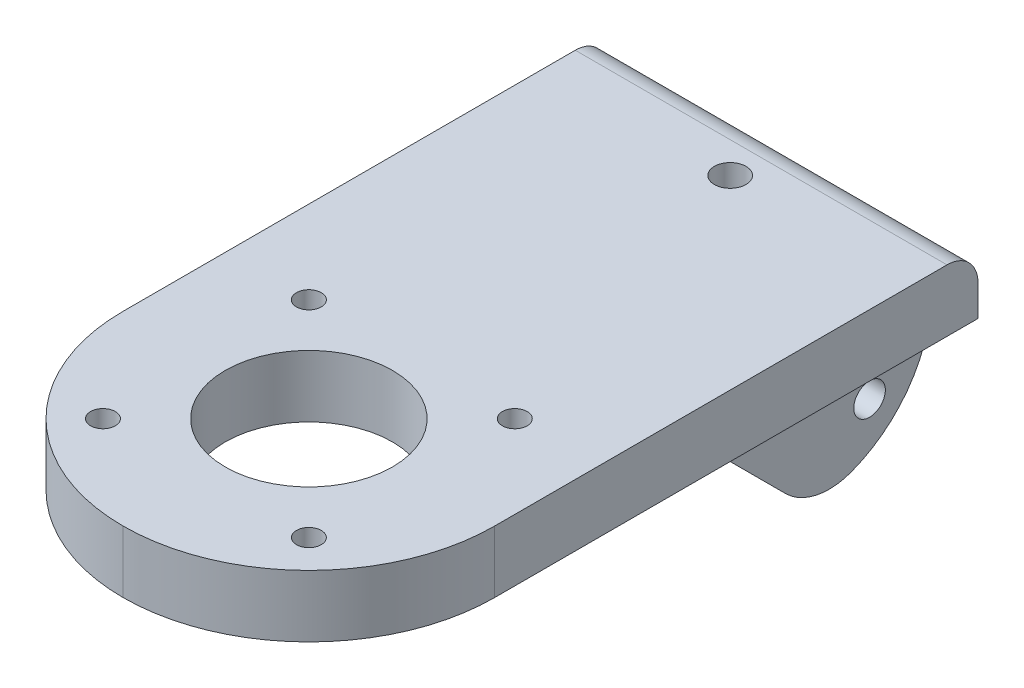
ISO-10303-21;
HEADER;
FILE_DESCRIPTION(('STEP AP214'),'2;1');
FILE_NAME('part.step','',(''),(''),'','','');
FILE_SCHEMA(('AUTOMOTIVE_DESIGN { 1 0 10303 214 1 1 1 1 }'));
ENDSEC;
DATA;
#1=APPLICATION_CONTEXT('core data for automotive mechanical design processes');
#2=APPLICATION_PROTOCOL_DEFINITION('international standard','automotive_design',2000,#1);
#3=PRODUCT_CONTEXT('',#1,'mechanical');
#4=PRODUCT('Part','Part','',(#3));
#5=PRODUCT_RELATED_PRODUCT_CATEGORY('part','',(#4));
#6=PRODUCT_DEFINITION_FORMATION('','',#4);
#7=PRODUCT_DEFINITION_CONTEXT('part definition',#1,'design');
#8=PRODUCT_DEFINITION('design','',#6,#7);
#9=PRODUCT_DEFINITION_SHAPE('','',#8);
#10=(LENGTH_UNIT() NAMED_UNIT(*) SI_UNIT(.MILLI.,.METRE.));
#11=(NAMED_UNIT(*) PLANE_ANGLE_UNIT() SI_UNIT($,.RADIAN.));
#12=(NAMED_UNIT(*) SI_UNIT($,.STERADIAN.) SOLID_ANGLE_UNIT());
#13=UNCERTAINTY_MEASURE_WITH_UNIT(LENGTH_MEASURE(1.E-05),#10,'distance_accuracy_value','');
#14=(GEOMETRIC_REPRESENTATION_CONTEXT(3) GLOBAL_UNCERTAINTY_ASSIGNED_CONTEXT((#13)) GLOBAL_UNIT_ASSIGNED_CONTEXT((#10,
#11,#12)) REPRESENTATION_CONTEXT('',''));
#15=CARTESIAN_POINT('',(0.,0.,0.));
#16=DIRECTION('',(0.,0.,1.));
#17=DIRECTION('',(1.,0.,0.));
#18=AXIS2_PLACEMENT_3D('',#15,#16,#17);
#19=CARTESIAN_POINT('',(-30.,10.,0.));
#20=DIRECTION('',(-1.,0.,0.));
#21=DIRECTION('',(0.,0.,1.));
#22=AXIS2_PLACEMENT_3D('',#19,#20,#21);
#23=PLANE('',#22);
#24=DIRECTION('',(0.,0.,-1.));
#25=VECTOR('',#24,1.);
#26=CARTESIAN_POINT('',(-30.,10.,0.));
#27=LINE('',#26,#25);
#28=CARTESIAN_POINT('',(-30.,10.,0.));
#29=VERTEX_POINT('',#28);
#30=CARTESIAN_POINT('',(-30.,10.,-73.));
#31=VERTEX_POINT('',#30);
#32=EDGE_CURVE('E395',#29,#31,#27,.T.);
#33=ORIENTED_EDGE('',*,*,#32,.T.);
#34=CARTESIAN_POINT('',(-30.,5.,-73.));
#35=DIRECTION('',(-1.,0.,0.));
#36=DIRECTION('',(0.,0.,1.));
#37=AXIS2_PLACEMENT_3D('',#34,#35,#36);
#38=CIRCLE('',#37,5.);
#39=CARTESIAN_POINT('',(-30.,5.,-78.));
#40=VERTEX_POINT('',#39);
#41=EDGE_CURVE('E262',#31,#40,#38,.T.);
#42=ORIENTED_EDGE('',*,*,#41,.T.);
#43=DIRECTION('',(0.,-1.,0.));
#44=VECTOR('',#43,1.);
#45=CARTESIAN_POINT('',(-30.,10.,-78.));
#46=LINE('',#45,#44);
#47=CARTESIAN_POINT('',(-30.,0.,-78.));
#48=VERTEX_POINT('',#47);
#49=EDGE_CURVE('E176',#40,#48,#46,.T.);
#50=ORIENTED_EDGE('',*,*,#49,.T.);
#51=DIRECTION('',(0.,0.,-1.));
#52=VECTOR('',#51,1.);
#53=CARTESIAN_POINT('',(-30.,0.,0.));
#54=LINE('',#53,#52);
#55=CARTESIAN_POINT('',(-30.,0.,0.));
#56=VERTEX_POINT('',#55);
#57=EDGE_CURVE('E182',#56,#48,#54,.T.);
#58=ORIENTED_EDGE('',*,*,#57,.F.);
#59=DIRECTION('',(0.,-1.,0.));
#60=VECTOR('',#59,1.);
#61=CARTESIAN_POINT('',(-30.,10.,0.));
#62=LINE('',#61,#60);
#63=EDGE_CURVE('E198',#56,#29,#62,.F.);
#64=ORIENTED_EDGE('',*,*,#63,.T.);
#65=EDGE_LOOP('',(#33,#42,#50,#58,#64));
#66=FACE_BOUND('',#65,.T.);
#67=ADVANCED_FACE('F38',(#66),#23,.T.);
#68=CARTESIAN_POINT('',(30.,10.,0.));
#69=DIRECTION('',(-1.,0.,0.));
#70=DIRECTION('',(0.,0.,1.));
#71=AXIS2_PLACEMENT_3D('',#68,#69,#70);
#72=PLANE('',#71);
#73=DIRECTION('',(0.,-1.,0.));
#74=VECTOR('',#73,1.);
#75=CARTESIAN_POINT('',(30.,10.,-78.));
#76=LINE('',#75,#74);
#77=CARTESIAN_POINT('',(30.,5.,-78.));
#78=VERTEX_POINT('',#77);
#79=CARTESIAN_POINT('',(30.,0.,-78.));
#80=VERTEX_POINT('',#79);
#81=EDGE_CURVE('E169',#78,#80,#76,.T.);
#82=ORIENTED_EDGE('',*,*,#81,.F.);
#83=CARTESIAN_POINT('',(30.,5.,-73.));
#84=DIRECTION('',(-1.,0.,0.));
#85=DIRECTION('',(0.,0.,1.));
#86=AXIS2_PLACEMENT_3D('',#83,#84,#85);
#87=CIRCLE('',#86,5.);
#88=CARTESIAN_POINT('',(30.,10.,-73.));
#89=VERTEX_POINT('',#88);
#90=EDGE_CURVE('E258',#78,#89,#87,.F.);
#91=ORIENTED_EDGE('',*,*,#90,.T.);
#92=DIRECTION('',(0.,0.,-1.));
#93=VECTOR('',#92,1.);
#94=CARTESIAN_POINT('',(30.,10.,0.));
#95=LINE('',#94,#93);
#96=CARTESIAN_POINT('',(30.,10.,0.));
#97=VERTEX_POINT('',#96);
#98=EDGE_CURVE('E389',#97,#89,#95,.T.);
#99=ORIENTED_EDGE('',*,*,#98,.F.);
#100=DIRECTION('',(0.,-1.,0.));
#101=VECTOR('',#100,1.);
#102=CARTESIAN_POINT('',(30.,0.,0.));
#103=LINE('',#102,#101);
#104=CARTESIAN_POINT('',(30.,0.,0.));
#105=VERTEX_POINT('',#104);
#106=EDGE_CURVE('E181',#97,#105,#103,.T.);
#107=ORIENTED_EDGE('',*,*,#106,.T.);
#108=DIRECTION('',(0.,0.,-1.));
#109=VECTOR('',#108,1.);
#110=CARTESIAN_POINT('',(30.,0.,0.));
#111=LINE('',#110,#109);
#112=EDGE_CURVE('E159',#105,#80,#111,.T.);
#113=ORIENTED_EDGE('',*,*,#112,.T.);
#114=EDGE_LOOP('',(#82,#91,#99,#107,#113));
#115=FACE_BOUND('',#114,.T.);
#116=ADVANCED_FACE('F178',(#115),#72,.F.);
#117=CARTESIAN_POINT('',(0.,10.,-78.));
#118=DIRECTION('',(0.,0.,-1.));
#119=DIRECTION('',(-1.,0.,0.));
#120=AXIS2_PLACEMENT_3D('',#117,#118,#119);
#121=PLANE('',#120);
#122=ORIENTED_EDGE('',*,*,#49,.F.);
#123=DIRECTION('',(1.,0.,0.));
#124=VECTOR('',#123,1.);
#125=CARTESIAN_POINT('',(0.,5.,-78.));
#126=LINE('',#125,#124);
#127=EDGE_CURVE('E173',#40,#78,#126,.T.);
#128=ORIENTED_EDGE('',*,*,#127,.T.);
#129=ORIENTED_EDGE('',*,*,#81,.T.);
#130=DIRECTION('',(1.,0.,0.));
#131=VECTOR('',#130,1.);
#132=CARTESIAN_POINT('',(0.,0.,-78.));
#133=LINE('',#132,#131);
#134=CARTESIAN_POINT('',(27.5,0.,-78.));
#135=VERTEX_POINT('',#134);
#136=EDGE_CURVE('E154',#135,#80,#133,.T.);
#137=ORIENTED_EDGE('',*,*,#136,.F.);
#138=DIRECTION('',(1.,0.,0.));
#139=VECTOR('',#138,1.);
#140=CARTESIAN_POINT('',(0.,0.,-78.));
#141=LINE('',#140,#139);
#142=CARTESIAN_POINT('',(10.5,0.,-78.));
#143=VERTEX_POINT('',#142);
#144=EDGE_CURVE('E227',#135,#143,#141,.F.);
#145=ORIENTED_EDGE('',*,*,#144,.T.);
#146=CARTESIAN_POINT('',(-10.5,0.,-78.));
#147=VERTEX_POINT('',#146);
#148=EDGE_CURVE('E164',#147,#143,#133,.T.);
#149=ORIENTED_EDGE('',*,*,#148,.F.);
#150=DIRECTION('',(1.,0.,0.));
#151=VECTOR('',#150,1.);
#152=CARTESIAN_POINT('',(0.,0.,-78.));
#153=LINE('',#152,#151);
#154=CARTESIAN_POINT('',(-27.5,0.,-78.));
#155=VERTEX_POINT('',#154);
#156=EDGE_CURVE('E60',#147,#155,#153,.F.);
#157=ORIENTED_EDGE('',*,*,#156,.T.);
#158=EDGE_CURVE('E166',#48,#155,#133,.T.);
#159=ORIENTED_EDGE('',*,*,#158,.F.);
#160=EDGE_LOOP('',(#122,#128,#129,#137,#145,#149,#157,#159));
#161=FACE_BOUND('',#160,.T.);
#162=ADVANCED_FACE('F171',(#161),#121,.T.);
#163=CARTESIAN_POINT('',(0.,10.,0.));
#164=DIRECTION('',(0.,-1.,0.));
#165=DIRECTION('',(0.,0.,-1.));
#166=AXIS2_PLACEMENT_3D('',#163,#164,#165);
#167=CYLINDRICAL_SURFACE('',#166,13.5);
#168=CARTESIAN_POINT('',(0.,10.,0.));
#169=DIRECTION('',(0.,1.,0.));
#170=DIRECTION('',(0.,0.,1.));
#171=AXIS2_PLACEMENT_3D('',#168,#169,#170);
#172=CIRCLE('',#171,13.5);
#173=CARTESIAN_POINT('',(0.,10.,13.5));
#174=VERTEX_POINT('',#173);
#175=EDGE_CURVE('E399',#174,#174,#172,.T.);
#176=ORIENTED_EDGE('',*,*,#175,.T.);
#177=EDGE_LOOP('',(#176));
#178=FACE_BOUND('',#177,.T.);
#179=CARTESIAN_POINT('',(0.,0.,0.));
#180=DIRECTION('',(0.,1.,0.));
#181=DIRECTION('',(0.,0.,1.));
#182=AXIS2_PLACEMENT_3D('',#179,#180,#181);
#183=CIRCLE('',#182,13.5);
#184=CARTESIAN_POINT('',(0.,0.,13.5));
#185=VERTEX_POINT('',#184);
#186=EDGE_CURVE('E185',#185,#185,#183,.T.);
#187=ORIENTED_EDGE('',*,*,#186,.F.);
#188=EDGE_LOOP('',(#187));
#189=FACE_BOUND('',#188,.T.);
#190=ADVANCED_FACE('F324',(#178,#189),#167,.F.);
#191=CARTESIAN_POINT('',(16.6170093578841,10.,-16.6170093578845));
#192=DIRECTION('',(0.,-1.,0.));
#193=DIRECTION('',(0.,0.,-1.));
#194=AXIS2_PLACEMENT_3D('',#191,#192,#193);
#195=CYLINDRICAL_SURFACE('',#194,2.00000000000051);
#196=CARTESIAN_POINT('',(16.6170093578841,10.,-16.6170093578845));
#197=DIRECTION('',(0.,1.,0.));
#198=DIRECTION('',(0.,0.,1.));
#199=AXIS2_PLACEMENT_3D('',#196,#197,#198);
#200=CIRCLE('',#199,2.00000000000051);
#201=CARTESIAN_POINT('',(16.6170093578841,10.,-14.617009357884));
#202=VERTEX_POINT('',#201);
#203=EDGE_CURVE('E598',#202,#202,#200,.T.);
#204=ORIENTED_EDGE('',*,*,#203,.T.);
#205=EDGE_LOOP('',(#204));
#206=FACE_BOUND('',#205,.T.);
#207=CARTESIAN_POINT('',(16.6170093578841,0.,-16.6170093578845));
#208=DIRECTION('',(0.,1.,0.));
#209=DIRECTION('',(0.,0.,1.));
#210=AXIS2_PLACEMENT_3D('',#207,#208,#209);
#211=CIRCLE('',#210,2.00000000000051);
#212=CARTESIAN_POINT('',(16.6170093578841,0.,-14.617009357884));
#213=VERTEX_POINT('',#212);
#214=EDGE_CURVE('E411',#213,#213,#211,.T.);
#215=ORIENTED_EDGE('',*,*,#214,.F.);
#216=EDGE_LOOP('',(#215));
#217=FACE_BOUND('',#216,.T.);
#218=ADVANCED_FACE('F327',(#206,#217),#195,.F.);
#219=CARTESIAN_POINT('',(16.6170093578861,10.,16.6170093578829));
#220=DIRECTION('',(0.,-1.,0.));
#221=DIRECTION('',(0.,0.,-1.));
#222=AXIS2_PLACEMENT_3D('',#219,#220,#221);
#223=CYLINDRICAL_SURFACE('',#222,2.00000000000225);
#224=CARTESIAN_POINT('',(16.6170093578861,10.,16.6170093578829));
#225=DIRECTION('',(0.,1.,0.));
#226=DIRECTION('',(0.,0.,1.));
#227=AXIS2_PLACEMENT_3D('',#224,#225,#226);
#228=CIRCLE('',#227,2.00000000000225);
#229=CARTESIAN_POINT('',(16.6170093578861,10.,18.6170093578852));
#230=VERTEX_POINT('',#229);
#231=EDGE_CURVE('E595',#230,#230,#228,.T.);
#232=ORIENTED_EDGE('',*,*,#231,.T.);
#233=EDGE_LOOP('',(#232));
#234=FACE_BOUND('',#233,.T.);
#235=CARTESIAN_POINT('',(16.6170093578861,0.,16.6170093578829));
#236=DIRECTION('',(0.,1.,0.));
#237=DIRECTION('',(0.,0.,1.));
#238=AXIS2_PLACEMENT_3D('',#235,#236,#237);
#239=CIRCLE('',#238,2.00000000000225);
#240=CARTESIAN_POINT('',(16.6170093578861,0.,18.6170093578852));
#241=VERTEX_POINT('',#240);
#242=EDGE_CURVE('E408',#241,#241,#239,.T.);
#243=ORIENTED_EDGE('',*,*,#242,.F.);
#244=EDGE_LOOP('',(#243));
#245=FACE_BOUND('',#244,.T.);
#246=ADVANCED_FACE('F331',(#234,#245),#223,.F.);
#247=CARTESIAN_POINT('',(-16.6170093578816,10.,16.6170093578848));
#248=DIRECTION('',(0.,-1.,0.));
#249=DIRECTION('',(0.,0.,-1.));
#250=AXIS2_PLACEMENT_3D('',#247,#248,#249);
#251=CYLINDRICAL_SURFACE('',#250,2.00000000000264);
#252=CARTESIAN_POINT('',(-16.6170093578816,10.,16.6170093578848));
#253=DIRECTION('',(0.,1.,0.));
#254=DIRECTION('',(0.,0.,1.));
#255=AXIS2_PLACEMENT_3D('',#252,#253,#254);
#256=CIRCLE('',#255,2.00000000000264);
#257=CARTESIAN_POINT('',(-16.6170093578816,10.,18.6170093578875));
#258=VERTEX_POINT('',#257);
#259=EDGE_CURVE('E592',#258,#258,#256,.T.);
#260=ORIENTED_EDGE('',*,*,#259,.T.);
#261=EDGE_LOOP('',(#260));
#262=FACE_BOUND('',#261,.T.);
#263=CARTESIAN_POINT('',(-16.6170093578816,0.,16.6170093578848));
#264=DIRECTION('',(0.,1.,0.));
#265=DIRECTION('',(0.,0.,1.));
#266=AXIS2_PLACEMENT_3D('',#263,#264,#265);
#267=CIRCLE('',#266,2.00000000000264);
#268=CARTESIAN_POINT('',(-16.6170093578816,0.,18.6170093578875));
#269=VERTEX_POINT('',#268);
#270=EDGE_CURVE('E405',#269,#269,#267,.T.);
#271=ORIENTED_EDGE('',*,*,#270,.F.);
#272=EDGE_LOOP('',(#271));
#273=FACE_BOUND('',#272,.T.);
#274=ADVANCED_FACE('F335',(#262,#273),#251,.F.);
#275=CARTESIAN_POINT('',(-16.6170093578835,10.,-16.6170093578829));
#276=DIRECTION('',(0.,-1.,0.));
#277=DIRECTION('',(0.,0.,-1.));
#278=AXIS2_PLACEMENT_3D('',#275,#276,#277);
#279=CYLINDRICAL_SURFACE('',#278,2.00000000000093);
#280=CARTESIAN_POINT('',(-16.6170093578835,10.,-16.6170093578829));
#281=DIRECTION('',(0.,1.,0.));
#282=DIRECTION('',(0.,0.,1.));
#283=AXIS2_PLACEMENT_3D('',#280,#281,#282);
#284=CIRCLE('',#283,2.00000000000093);
#285=CARTESIAN_POINT('',(-16.6170093578835,10.,-14.617009357882));
#286=VERTEX_POINT('',#285);
#287=EDGE_CURVE('E192',#286,#286,#284,.T.);
#288=ORIENTED_EDGE('',*,*,#287,.T.);
#289=EDGE_LOOP('',(#288));
#290=FACE_BOUND('',#289,.T.);
#291=CARTESIAN_POINT('',(-16.6170093578835,0.,-16.6170093578829));
#292=DIRECTION('',(0.,1.,0.));
#293=DIRECTION('',(0.,0.,1.));
#294=AXIS2_PLACEMENT_3D('',#291,#292,#293);
#295=CIRCLE('',#294,2.00000000000093);
#296=CARTESIAN_POINT('',(-16.6170093578835,0.,-14.617009357882));
#297=VERTEX_POINT('',#296);
#298=EDGE_CURVE('E210',#297,#297,#295,.T.);
#299=ORIENTED_EDGE('',*,*,#298,.F.);
#300=EDGE_LOOP('',(#299));
#301=FACE_BOUND('',#300,.T.);
#302=ADVANCED_FACE('F339',(#290,#301),#279,.F.);
#303=CARTESIAN_POINT('',(0.,10.,-68.));
#304=DIRECTION('',(0.,-1.,0.));
#305=DIRECTION('',(0.,0.,-1.));
#306=AXIS2_PLACEMENT_3D('',#303,#304,#305);
#307=CYLINDRICAL_SURFACE('',#306,2.55);
#308=CARTESIAN_POINT('',(0.,10.,-68.));
#309=DIRECTION('',(0.,1.,0.));
#310=DIRECTION('',(0.,0.,1.));
#311=AXIS2_PLACEMENT_3D('',#308,#309,#310);
#312=CIRCLE('',#311,2.55);
#313=CARTESIAN_POINT('',(0.,10.,-65.45));
#314=VERTEX_POINT('',#313);
#315=EDGE_CURVE('E193',#314,#314,#312,.T.);
#316=ORIENTED_EDGE('',*,*,#315,.T.);
#317=EDGE_LOOP('',(#316));
#318=FACE_BOUND('',#317,.T.);
#319=CARTESIAN_POINT('',(0.,0.,-68.));
#320=DIRECTION('',(0.,1.,0.));
#321=DIRECTION('',(0.,0.,1.));
#322=AXIS2_PLACEMENT_3D('',#319,#320,#321);
#323=CIRCLE('',#322,2.55);
#324=CARTESIAN_POINT('',(0.,0.,-65.45));
#325=VERTEX_POINT('',#324);
#326=EDGE_CURVE('E189',#325,#325,#323,.T.);
#327=ORIENTED_EDGE('',*,*,#326,.F.);
#328=EDGE_LOOP('',(#327));
#329=FACE_BOUND('',#328,.T.);
#330=ADVANCED_FACE('F343',(#318,#329),#307,.F.);
#331=CARTESIAN_POINT('',(0.,10.,0.));
#332=DIRECTION('',(0.,1.,0.));
#333=DIRECTION('',(0.,0.,1.));
#334=AXIS2_PLACEMENT_3D('',#331,#332,#333);
#335=PLANE('',#334);
#336=ORIENTED_EDGE('',*,*,#287,.F.);
#337=EDGE_LOOP('',(#336));
#338=FACE_BOUND('',#337,.T.);
#339=ORIENTED_EDGE('',*,*,#259,.F.);
#340=EDGE_LOOP('',(#339));
#341=FACE_BOUND('',#340,.T.);
#342=ORIENTED_EDGE('',*,*,#231,.F.);
#343=EDGE_LOOP('',(#342));
#344=FACE_BOUND('',#343,.T.);
#345=ORIENTED_EDGE('',*,*,#203,.F.);
#346=EDGE_LOOP('',(#345));
#347=FACE_BOUND('',#346,.T.);
#348=ORIENTED_EDGE('',*,*,#175,.F.);
#349=EDGE_LOOP('',(#348));
#350=FACE_BOUND('',#349,.T.);
#351=ORIENTED_EDGE('',*,*,#98,.T.);
#352=DIRECTION('',(1.,0.,0.));
#353=VECTOR('',#352,1.);
#354=CARTESIAN_POINT('',(0.,10.,-73.));
#355=LINE('',#354,#353);
#356=EDGE_CURVE('E260',#89,#31,#355,.F.);
#357=ORIENTED_EDGE('',*,*,#356,.T.);
#358=ORIENTED_EDGE('',*,*,#32,.F.);
#359=CARTESIAN_POINT('',(0.,10.,0.));
#360=DIRECTION('',(0.,1.,0.));
#361=DIRECTION('',(0.,0.,1.));
#362=AXIS2_PLACEMENT_3D('',#359,#360,#361);
#363=CIRCLE('',#362,30.);
#364=CARTESIAN_POINT('',(0.,10.,30.));
#365=VERTEX_POINT('',#364);
#366=EDGE_CURVE('E203',#29,#365,#363,.T.);
#367=ORIENTED_EDGE('',*,*,#366,.T.);
#368=CARTESIAN_POINT('',(0.,10.,0.));
#369=DIRECTION('',(0.,1.,0.));
#370=DIRECTION('',(0.,0.,1.));
#371=AXIS2_PLACEMENT_3D('',#368,#369,#370);
#372=CIRCLE('',#371,30.);
#373=EDGE_CURVE('E201',#365,#97,#372,.T.);
#374=ORIENTED_EDGE('',*,*,#373,.T.);
#375=EDGE_LOOP('',(#351,#357,#358,#367,#374));
#376=FACE_BOUND('',#375,.T.);
#377=ORIENTED_EDGE('',*,*,#315,.F.);
#378=EDGE_LOOP('',(#377));
#379=FACE_BOUND('',#378,.T.);
#380=ADVANCED_FACE('F391',(#338,#341,#344,#347,#350,#376,#379),#335,.T.);
#381=CARTESIAN_POINT('',(0.,0.,0.));
#382=DIRECTION('',(0.,1.,0.));
#383=DIRECTION('',(0.,0.,1.));
#384=AXIS2_PLACEMENT_3D('',#381,#382,#383);
#385=PLANE('',#384);
#386=ORIENTED_EDGE('',*,*,#158,.T.);
#387=DIRECTION('',(0.,0.,1.));
#388=VECTOR('',#387,1.);
#389=CARTESIAN_POINT('',(-27.5,0.,0.));
#390=LINE('',#389,#388);
#391=CARTESIAN_POINT('',(-27.5,0.,-38.));
#392=VERTEX_POINT('',#391);
#393=EDGE_CURVE('E265',#155,#392,#390,.T.);
#394=ORIENTED_EDGE('',*,*,#393,.T.);
#395=DIRECTION('',(-1.,0.,0.));
#396=VECTOR('',#395,1.);
#397=CARTESIAN_POINT('',(0.,0.,-38.));
#398=LINE('',#397,#396);
#399=CARTESIAN_POINT('',(-10.5,0.,-38.));
#400=VERTEX_POINT('',#399);
#401=EDGE_CURVE('E385',#400,#392,#398,.T.);
#402=ORIENTED_EDGE('',*,*,#401,.F.);
#403=DIRECTION('',(0.,0.,-1.));
#404=VECTOR('',#403,1.);
#405=CARTESIAN_POINT('',(-10.5,0.,0.));
#406=LINE('',#405,#404);
#407=EDGE_CURVE('E622',#400,#147,#406,.T.);
#408=ORIENTED_EDGE('',*,*,#407,.T.);
#409=ORIENTED_EDGE('',*,*,#148,.T.);
#410=DIRECTION('',(0.,0.,1.));
#411=VECTOR('',#410,1.);
#412=CARTESIAN_POINT('',(10.5,0.,0.));
#413=LINE('',#412,#411);
#414=CARTESIAN_POINT('',(10.5,0.,-38.));
#415=VERTEX_POINT('',#414);
#416=EDGE_CURVE('E211',#143,#415,#413,.T.);
#417=ORIENTED_EDGE('',*,*,#416,.T.);
#418=DIRECTION('',(1.,0.,0.));
#419=VECTOR('',#418,1.);
#420=CARTESIAN_POINT('',(0.,0.,-38.));
#421=LINE('',#420,#419);
#422=CARTESIAN_POINT('',(27.5,0.,-38.));
#423=VERTEX_POINT('',#422);
#424=EDGE_CURVE('E585',#415,#423,#421,.T.);
#425=ORIENTED_EDGE('',*,*,#424,.T.);
#426=DIRECTION('',(0.,0.,1.));
#427=VECTOR('',#426,1.);
#428=CARTESIAN_POINT('',(27.5,0.,-78.));
#429=LINE('',#428,#427);
#430=EDGE_CURVE('E162',#423,#135,#429,.F.);
#431=ORIENTED_EDGE('',*,*,#430,.T.);
#432=ORIENTED_EDGE('',*,*,#136,.T.);
#433=ORIENTED_EDGE('',*,*,#112,.F.);
#434=CARTESIAN_POINT('',(0.,0.,0.));
#435=DIRECTION('',(0.,1.,0.));
#436=DIRECTION('',(0.,0.,1.));
#437=AXIS2_PLACEMENT_3D('',#434,#435,#436);
#438=CIRCLE('',#437,30.);
#439=CARTESIAN_POINT('',(0.,0.,30.));
#440=VERTEX_POINT('',#439);
#441=EDGE_CURVE('E175',#105,#440,#438,.F.);
#442=ORIENTED_EDGE('',*,*,#441,.T.);
#443=CARTESIAN_POINT('',(0.,0.,0.));
#444=DIRECTION('',(0.,1.,0.));
#445=DIRECTION('',(0.,0.,1.));
#446=AXIS2_PLACEMENT_3D('',#443,#444,#445);
#447=CIRCLE('',#446,30.);
#448=EDGE_CURVE('E196',#440,#56,#447,.F.);
#449=ORIENTED_EDGE('',*,*,#448,.T.);
#450=ORIENTED_EDGE('',*,*,#57,.T.);
#451=EDGE_LOOP('',(#386,#394,#402,#408,#409,#417,#425,#431,#432,#433,#442,#449,#450));
#452=FACE_BOUND('',#451,.T.);
#453=ORIENTED_EDGE('',*,*,#298,.T.);
#454=EDGE_LOOP('',(#453));
#455=FACE_BOUND('',#454,.T.);
#456=ORIENTED_EDGE('',*,*,#270,.T.);
#457=EDGE_LOOP('',(#456));
#458=FACE_BOUND('',#457,.T.);
#459=ORIENTED_EDGE('',*,*,#242,.T.);
#460=EDGE_LOOP('',(#459));
#461=FACE_BOUND('',#460,.T.);
#462=ORIENTED_EDGE('',*,*,#214,.T.);
#463=EDGE_LOOP('',(#462));
#464=FACE_BOUND('',#463,.T.);
#465=ORIENTED_EDGE('',*,*,#186,.T.);
#466=EDGE_LOOP('',(#465));
#467=FACE_BOUND('',#466,.T.);
#468=ORIENTED_EDGE('',*,*,#326,.T.);
#469=EDGE_LOOP('',(#468));
#470=FACE_BOUND('',#469,.T.);
#471=ADVANCED_FACE('F156',(#452,#455,#458,#461,#464,#467,#470),#385,.F.);
#472=CARTESIAN_POINT('',(0.,10.,0.));
#473=DIRECTION('',(0.,1.,0.));
#474=DIRECTION('',(0.,0.,1.));
#475=AXIS2_PLACEMENT_3D('',#472,#473,#474);
#476=CYLINDRICAL_SURFACE('',#475,30.);
#477=ORIENTED_EDGE('',*,*,#106,.F.);
#478=ORIENTED_EDGE('',*,*,#373,.F.);
#479=DIRECTION('',(0.,-1.,0.));
#480=VECTOR('',#479,1.);
#481=CARTESIAN_POINT('',(0.,10.,30.));
#482=LINE('',#481,#480);
#483=EDGE_CURVE('E207',#440,#365,#482,.F.);
#484=ORIENTED_EDGE('',*,*,#483,.F.);
#485=ORIENTED_EDGE('',*,*,#441,.F.);
#486=EDGE_LOOP('',(#477,#478,#484,#485));
#487=FACE_BOUND('',#486,.T.);
#488=ADVANCED_FACE('F349',(#487),#476,.T.);
#489=CARTESIAN_POINT('',(0.,10.,0.));
#490=DIRECTION('',(0.,-1.,0.));
#491=DIRECTION('',(0.,0.,-1.));
#492=AXIS2_PLACEMENT_3D('',#489,#490,#491);
#493=CYLINDRICAL_SURFACE('',#492,30.);
#494=ORIENTED_EDGE('',*,*,#366,.F.);
#495=ORIENTED_EDGE('',*,*,#63,.F.);
#496=ORIENTED_EDGE('',*,*,#448,.F.);
#497=ORIENTED_EDGE('',*,*,#483,.T.);
#498=EDGE_LOOP('',(#494,#495,#496,#497));
#499=FACE_BOUND('',#498,.T.);
#500=ADVANCED_FACE('F345',(#499),#493,.T.);
#501=CARTESIAN_POINT('',(22.5,-20.,0.));
#502=DIRECTION('',(-1.,0.,0.));
#503=DIRECTION('',(0.,0.,1.));
#504=AXIS2_PLACEMENT_3D('',#501,#502,#503);
#505=PLANE('',#504);
#506=CARTESIAN_POINT('',(22.5,-10.,-68.));
#507=DIRECTION('',(-1.,0.,0.));
#508=DIRECTION('',(0.,0.,1.));
#509=AXIS2_PLACEMENT_3D('',#506,#507,#508);
#510=CIRCLE('',#509,2.54999999999999);
#511=CARTESIAN_POINT('',(22.5,-10.,-65.45));
#512=VERTEX_POINT('',#511);
#513=EDGE_CURVE('E624',#512,#512,#510,.T.);
#514=ORIENTED_EDGE('',*,*,#513,.T.);
#515=EDGE_LOOP('',(#514));
#516=FACE_BOUND('',#515,.T.);
#517=CARTESIAN_POINT('',(22.5,0.,-58.));
#518=DIRECTION('',(-1.,0.,0.));
#519=DIRECTION('',(0.,0.,1.));
#520=AXIS2_PLACEMENT_3D('',#517,#518,#519);
#521=CIRCLE('',#520,20.);
#522=CARTESIAN_POINT('',(22.5,-18.7297494343807,-65.0140206818427));
#523=VERTEX_POINT('',#522);
#524=CARTESIAN_POINT('',(22.5,-5.,-77.3649167310371));
#525=VERTEX_POINT('',#524);
#526=EDGE_CURVE('E232',#523,#525,#521,.F.);
#527=ORIENTED_EDGE('',*,*,#526,.T.);
#528=DIRECTION('',(0.,0.,1.));
#529=VECTOR('',#528,1.);
#530=CARTESIAN_POINT('',(22.5,-5.,-38.));
#531=LINE('',#530,#529);
#532=CARTESIAN_POINT('',(22.5,-5.,-43.));
#533=VERTEX_POINT('',#532);
#534=EDGE_CURVE('E270',#525,#533,#531,.T.);
#535=ORIENTED_EDGE('',*,*,#534,.T.);
#536=DIRECTION('',(0.,0.707106781186546,0.707106781186549));
#537=VECTOR('',#536,1.);
#538=CARTESIAN_POINT('',(22.5,0.,-38.));
#539=LINE('',#538,#537);
#540=CARTESIAN_POINT('',(22.5,-16.4359425290558,-54.4359425290559));
#541=VERTEX_POINT('',#540);
#542=EDGE_CURVE('E217',#533,#541,#539,.F.);
#543=ORIENTED_EDGE('',*,*,#542,.T.);
#544=CARTESIAN_POINT('',(22.5,-9.36487471719033,-61.5070103409214));
#545=DIRECTION('',(-1.,0.,0.));
#546=DIRECTION('',(0.,0.,1.));
#547=AXIS2_PLACEMENT_3D('',#544,#545,#546);
#548=CIRCLE('',#547,10.);
#549=EDGE_CURVE('E255',#541,#523,#548,.F.);
#550=ORIENTED_EDGE('',*,*,#549,.T.);
#551=EDGE_LOOP('',(#527,#535,#543,#550));
#552=FACE_BOUND('',#551,.T.);
#553=ADVANCED_FACE('F348',(#516,#552),#505,.F.);
#554=CARTESIAN_POINT('',(10.5,-20.,0.));
#555=DIRECTION('',(-1.,0.,0.));
#556=DIRECTION('',(0.,0.,1.));
#557=AXIS2_PLACEMENT_3D('',#554,#555,#556);
#558=PLANE('',#557);
#559=CARTESIAN_POINT('',(10.5,-10.,-68.));
#560=DIRECTION('',(-1.,0.,0.));
#561=DIRECTION('',(0.,0.,1.));
#562=AXIS2_PLACEMENT_3D('',#559,#560,#561);
#563=CIRCLE('',#562,2.54999999999999);
#564=CARTESIAN_POINT('',(10.5,-10.,-65.45));
#565=VERTEX_POINT('',#564);
#566=EDGE_CURVE('E627',#565,#565,#563,.T.);
#567=ORIENTED_EDGE('',*,*,#566,.F.);
#568=EDGE_LOOP('',(#567));
#569=FACE_BOUND('',#568,.T.);
#570=CARTESIAN_POINT('',(10.5,0.,-58.));
#571=DIRECTION('',(-1.,0.,0.));
#572=DIRECTION('',(0.,0.,1.));
#573=AXIS2_PLACEMENT_3D('',#570,#571,#572);
#574=CIRCLE('',#573,20.);
#575=CARTESIAN_POINT('',(10.5,-18.7297494343807,-65.0140206818427));
#576=VERTEX_POINT('',#575);
#577=EDGE_CURVE('E235',#143,#576,#574,.T.);
#578=ORIENTED_EDGE('',*,*,#577,.T.);
#579=CARTESIAN_POINT('',(10.5,-9.36487471719033,-61.5070103409214));
#580=DIRECTION('',(-1.,0.,0.));
#581=DIRECTION('',(0.,0.,1.));
#582=AXIS2_PLACEMENT_3D('',#579,#580,#581);
#583=CIRCLE('',#582,10.);
#584=CARTESIAN_POINT('',(10.5,-16.4359425290558,-54.4359425290559));
#585=VERTEX_POINT('',#584);
#586=EDGE_CURVE('E250',#576,#585,#583,.T.);
#587=ORIENTED_EDGE('',*,*,#586,.T.);
#588=DIRECTION('',(0.,-0.707106781186546,-0.707106781186549));
#589=VECTOR('',#588,1.);
#590=CARTESIAN_POINT('',(10.5,9.00000000000005,-28.9999999999999));
#591=LINE('',#590,#589);
#592=EDGE_CURVE('E219',#585,#415,#591,.F.);
#593=ORIENTED_EDGE('',*,*,#592,.T.);
#594=ORIENTED_EDGE('',*,*,#416,.F.);
#595=EDGE_LOOP('',(#578,#587,#593,#594));
#596=FACE_BOUND('',#595,.T.);
#597=ADVANCED_FACE('F500',(#569,#596),#558,.T.);
#598=CARTESIAN_POINT('',(-22.5,-20.,0.));
#599=DIRECTION('',(-1.,0.,0.));
#600=DIRECTION('',(0.,0.,1.));
#601=AXIS2_PLACEMENT_3D('',#598,#599,#600);
#602=PLANE('',#601);
#603=CARTESIAN_POINT('',(-22.5,-10.,-68.));
#604=DIRECTION('',(-1.,0.,0.));
#605=DIRECTION('',(0.,0.,1.));
#606=AXIS2_PLACEMENT_3D('',#603,#604,#605);
#607=CIRCLE('',#606,2.54999999999999);
#608=CARTESIAN_POINT('',(-22.5,-10.,-65.45));
#609=VERTEX_POINT('',#608);
#610=EDGE_CURVE('E225',#609,#609,#607,.T.);
#611=ORIENTED_EDGE('',*,*,#610,.F.);
#612=EDGE_LOOP('',(#611));
#613=FACE_BOUND('',#612,.T.);
#614=DIRECTION('',(0.,0.707106781186549,0.707106781186546));
#615=VECTOR('',#614,1.);
#616=CARTESIAN_POINT('',(-22.5,9.00000000000001,-29.0000000000001));
#617=LINE('',#616,#615);
#618=CARTESIAN_POINT('',(-22.5,-16.4359425290558,-54.4359425290559));
#619=VERTEX_POINT('',#618);
#620=CARTESIAN_POINT('',(-22.5,-5.,-43.0000000000001));
#621=VERTEX_POINT('',#620);
#622=EDGE_CURVE('E206',#619,#621,#617,.T.);
#623=ORIENTED_EDGE('',*,*,#622,.T.);
#624=DIRECTION('',(0.,0.,1.));
#625=VECTOR('',#624,1.);
#626=CARTESIAN_POINT('',(-22.5,-5.,0.));
#627=LINE('',#626,#625);
#628=CARTESIAN_POINT('',(-22.5,-5.,-77.3649167310371));
#629=VERTEX_POINT('',#628);
#630=EDGE_CURVE('E268',#621,#629,#627,.F.);
#631=ORIENTED_EDGE('',*,*,#630,.T.);
#632=CARTESIAN_POINT('',(-22.5,0.,-58.));
#633=DIRECTION('',(-1.,0.,0.));
#634=DIRECTION('',(0.,0.,1.));
#635=AXIS2_PLACEMENT_3D('',#632,#633,#634);
#636=CIRCLE('',#635,20.);
#637=CARTESIAN_POINT('',(-22.5,-18.7297494343807,-65.0140206818427));
#638=VERTEX_POINT('',#637);
#639=EDGE_CURVE('E230',#629,#638,#636,.T.);
#640=ORIENTED_EDGE('',*,*,#639,.T.);
#641=CARTESIAN_POINT('',(-22.5,-9.36487471719034,-61.5070103409213));
#642=DIRECTION('',(-1.,0.,0.));
#643=DIRECTION('',(0.,0.,1.));
#644=AXIS2_PLACEMENT_3D('',#641,#642,#643);
#645=CIRCLE('',#644,10.);
#646=EDGE_CURVE('E241',#638,#619,#645,.T.);
#647=ORIENTED_EDGE('',*,*,#646,.T.);
#648=EDGE_LOOP('',(#623,#631,#640,#647));
#649=FACE_BOUND('',#648,.T.);
#650=ADVANCED_FACE('F366',(#613,#649),#602,.T.);
#651=CARTESIAN_POINT('',(-10.5,-20.,0.));
#652=DIRECTION('',(1.,0.,0.));
#653=DIRECTION('',(0.,0.,-1.));
#654=AXIS2_PLACEMENT_3D('',#651,#652,#653);
#655=PLANE('',#654);
#656=CARTESIAN_POINT('',(-10.5,-10.,-68.));
#657=DIRECTION('',(1.,0.,0.));
#658=DIRECTION('',(0.,0.,-1.));
#659=AXIS2_PLACEMENT_3D('',#656,#657,#658);
#660=CIRCLE('',#659,2.54999999999999);
#661=CARTESIAN_POINT('',(-10.5,-10.,-70.55));
#662=VERTEX_POINT('',#661);
#663=EDGE_CURVE('E222',#662,#662,#660,.T.);
#664=ORIENTED_EDGE('',*,*,#663,.F.);
#665=EDGE_LOOP('',(#664));
#666=FACE_BOUND('',#665,.T.);
#667=DIRECTION('',(0.,-0.707106781186549,-0.707106781186546));
#668=VECTOR('',#667,1.);
#669=CARTESIAN_POINT('',(-10.5,9.00000000000001,-29.0000000000001));
#670=LINE('',#669,#668);
#671=CARTESIAN_POINT('',(-10.5,-16.4359425290558,-54.4359425290559));
#672=VERTEX_POINT('',#671);
#673=EDGE_CURVE('E214',#400,#672,#670,.T.);
#674=ORIENTED_EDGE('',*,*,#673,.T.);
#675=CARTESIAN_POINT('',(-10.5,-9.36487471719034,-61.5070103409213));
#676=DIRECTION('',(1.,0.,0.));
#677=DIRECTION('',(0.,0.,-1.));
#678=AXIS2_PLACEMENT_3D('',#675,#676,#677);
#679=CIRCLE('',#678,10.);
#680=CARTESIAN_POINT('',(-10.5,-18.7297494343807,-65.0140206818427));
#681=VERTEX_POINT('',#680);
#682=EDGE_CURVE('E245',#672,#681,#679,.T.);
#683=ORIENTED_EDGE('',*,*,#682,.T.);
#684=CARTESIAN_POINT('',(-10.5,0.,-58.));
#685=DIRECTION('',(1.,0.,0.));
#686=DIRECTION('',(0.,0.,-1.));
#687=AXIS2_PLACEMENT_3D('',#684,#685,#686);
#688=CIRCLE('',#687,20.);
#689=EDGE_CURVE('E221',#681,#147,#688,.T.);
#690=ORIENTED_EDGE('',*,*,#689,.T.);
#691=ORIENTED_EDGE('',*,*,#407,.F.);
#692=EDGE_LOOP('',(#674,#683,#690,#691));
#693=FACE_BOUND('',#692,.T.);
#694=ADVANCED_FACE('F358',(#666,#693),#655,.T.);
#695=CARTESIAN_POINT('',(0.,-20.,-58.));
#696=DIRECTION('',(0.,-0.707106781186546,0.707106781186549));
#697=DIRECTION('',(1.,0.,0.));
#698=AXIS2_PLACEMENT_3D('',#695,#696,#697);
#699=PLANE('',#698);
#700=ORIENTED_EDGE('',*,*,#622,.F.);
#701=DIRECTION('',(1.,0.,0.));
#702=VECTOR('',#701,1.);
#703=CARTESIAN_POINT('',(0.,-16.4359425290558,-54.4359425290559));
#704=LINE('',#703,#702);
#705=EDGE_CURVE('E243',#619,#672,#704,.T.);
#706=ORIENTED_EDGE('',*,*,#705,.T.);
#707=ORIENTED_EDGE('',*,*,#673,.F.);
#708=ORIENTED_EDGE('',*,*,#401,.T.);
#709=CARTESIAN_POINT('',(-27.5,-5.,-43.0000000000001));
#710=DIRECTION('',(0.,-0.707106781186546,0.707106781186549));
#711=DIRECTION('',(0.,0.707106781186549,0.707106781186546));
#712=AXIS2_PLACEMENT_3D('',#709,#710,#711);
#713=ELLIPSE('',#712,7.07106781186546,5.);
#714=EDGE_CURVE('E273',#392,#621,#713,.F.);
#715=ORIENTED_EDGE('',*,*,#714,.T.);
#716=EDGE_LOOP('',(#700,#706,#707,#708,#715));
#717=FACE_BOUND('',#716,.T.);
#718=ADVANCED_FACE('F354',(#717),#699,.T.);
#719=CARTESIAN_POINT('',(0.,0.,-38.));
#720=DIRECTION('',(0.,0.707106781186549,-0.707106781186546));
#721=DIRECTION('',(1.,0.,0.));
#722=AXIS2_PLACEMENT_3D('',#719,#720,#721);
#723=PLANE('',#722);
#724=ORIENTED_EDGE('',*,*,#592,.F.);
#725=DIRECTION('',(-1.,0.,0.));
#726=VECTOR('',#725,1.);
#727=CARTESIAN_POINT('',(0.,-16.4359425290558,-54.4359425290559));
#728=LINE('',#727,#726);
#729=EDGE_CURVE('E252',#585,#541,#728,.F.);
#730=ORIENTED_EDGE('',*,*,#729,.T.);
#731=ORIENTED_EDGE('',*,*,#542,.F.);
#732=CARTESIAN_POINT('',(27.5,-5.,-43.));
#733=DIRECTION('',(0.,0.707106781186549,-0.707106781186546));
#734=DIRECTION('',(0.,-0.707106781186546,-0.707106781186549));
#735=AXIS2_PLACEMENT_3D('',#732,#733,#734);
#736=ELLIPSE('',#735,7.07106781186549,5.);
#737=EDGE_CURVE('E53',#533,#423,#736,.T.);
#738=ORIENTED_EDGE('',*,*,#737,.T.);
#739=ORIENTED_EDGE('',*,*,#424,.F.);
#740=EDGE_LOOP('',(#724,#730,#731,#738,#739));
#741=FACE_BOUND('',#740,.T.);
#742=ADVANCED_FACE('F293',(#741),#723,.F.);
#743=CARTESIAN_POINT('',(-30.,-10.,-68.));
#744=DIRECTION('',(1.,0.,0.));
#745=DIRECTION('',(0.,0.,-1.));
#746=AXIS2_PLACEMENT_3D('',#743,#744,#745);
#747=CYLINDRICAL_SURFACE('',#746,2.54999999999999);
#748=ORIENTED_EDGE('',*,*,#610,.T.);
#749=EDGE_LOOP('',(#748));
#750=FACE_BOUND('',#749,.T.);
#751=ORIENTED_EDGE('',*,*,#663,.T.);
#752=EDGE_LOOP('',(#751));
#753=FACE_BOUND('',#752,.T.);
#754=ADVANCED_FACE('F364',(#750,#753),#747,.F.);
#755=ORIENTED_EDGE('',*,*,#566,.T.);
#756=EDGE_LOOP('',(#755));
#757=FACE_BOUND('',#756,.T.);
#758=ORIENTED_EDGE('',*,*,#513,.F.);
#759=EDGE_LOOP('',(#758));
#760=FACE_BOUND('',#759,.T.);
#761=ADVANCED_FACE('F290',(#757,#760),#747,.F.);
#762=CARTESIAN_POINT('',(0.,0.,-58.));
#763=DIRECTION('',(1.,0.,0.));
#764=DIRECTION('',(0.,0.,-1.));
#765=AXIS2_PLACEMENT_3D('',#762,#763,#764);
#766=CYLINDRICAL_SURFACE('',#765,20.);
#767=ORIENTED_EDGE('',*,*,#689,.F.);
#768=DIRECTION('',(1.,0.,0.));
#769=VECTOR('',#768,1.);
#770=CARTESIAN_POINT('',(0.,-18.7297494343807,-65.0140206818427));
#771=LINE('',#770,#769);
#772=EDGE_CURVE('E238',#681,#638,#771,.F.);
#773=ORIENTED_EDGE('',*,*,#772,.T.);
#774=ORIENTED_EDGE('',*,*,#639,.F.);
#775=CARTESIAN_POINT('',(-22.5,-5.,-77.3649167310371));
#776=CARTESIAN_POINT('',(-22.4999840988283,-4.86424129919503,-77.3999839190935));
#777=CARTESIAN_POINT('',(-22.5055288151948,-4.72809567436621,-77.4335997465508));
#778=CARTESIAN_POINT('',(-22.5278131512876,-4.45598298563545,-77.4977847539205));
#779=CARTESIAN_POINT('',(-22.5445544259319,-4.32001595110735,-77.5283534826861));
#780=CARTESIAN_POINT('',(-22.5892991342257,-4.04929265453971,-77.5862815461894));
#781=CARTESIAN_POINT('',(-22.6172993149196,-3.91453605426511,-77.6136418049808));
#782=CARTESIAN_POINT('',(-22.6845062810358,-3.64722168907809,-77.6651033357829));
#783=CARTESIAN_POINT('',(-22.7237122308864,-3.51466376099847,-77.6892048505885));
#784=CARTESIAN_POINT('',(-22.8132355096527,-3.25259097084883,-77.7341925605446));
#785=CARTESIAN_POINT('',(-22.8635674421324,-3.12308035809176,-77.7550744680322));
#786=CARTESIAN_POINT('',(-22.9750646907436,-2.86826166127894,-77.7936779877761));
#787=CARTESIAN_POINT('',(-23.0362340447445,-2.74295516438599,-77.8113984171544));
#788=CARTESIAN_POINT('',(-23.1689577544178,-2.4977015274731,-77.8438095314172));
#789=CARTESIAN_POINT('',(-23.240503044693,-2.37774982742647,-77.8585028342352));
#790=CARTESIAN_POINT('',(-23.3935686796742,-2.14399825344458,-77.8850978367924));
#791=CARTESIAN_POINT('',(-23.4750926895121,-2.03020066214176,-77.8969985061018));
#792=CARTESIAN_POINT('',(-23.6461079079841,-1.81151019116801,-77.9180898511828));
#793=CARTESIAN_POINT('',(-23.7354464712072,-1.70650185369456,-77.9273217823932));
#794=CARTESIAN_POINT('',(-23.9226173138137,-1.50409665444522,-77.9436207349857));
#795=CARTESIAN_POINT('',(-24.0204526955062,-1.40670259762285,-77.9506869613373));
#796=CARTESIAN_POINT('',(-24.2238988729426,-1.22029161983954,-77.9629560870785));
#797=CARTESIAN_POINT('',(-24.3295092092066,-1.13127420454791,-77.9681590964731));
#798=CARTESIAN_POINT('',(-24.5478109316147,-0.962222690738083,-77.9770192202398));
#799=CARTESIAN_POINT('',(-24.6605048646058,-0.882191852418535,-77.980675774903));
#800=CARTESIAN_POINT('',(-24.8928766022711,-0.73125061261634,-77.9867710245545));
#801=CARTESIAN_POINT('',(-25.0125935589767,-0.66040016758643,-77.9892019866215));
#802=CARTESIAN_POINT('',(-25.2575735768303,-0.528885838530237,-77.9931140893536));
#803=CARTESIAN_POINT('',(-25.3828389094869,-0.468226176248367,-77.9945948370853));
#804=CARTESIAN_POINT('',(-25.6379047746366,-0.357597065436426,-77.9968794539171));
#805=CARTESIAN_POINT('',(-25.7677018192995,-0.307619597535464,-77.9976838321238));
#806=CARTESIAN_POINT('',(-26.0310114949073,-0.218639664838884,-77.9988541579058));
#807=CARTESIAN_POINT('',(-26.1645249209752,-0.179639568804752,-77.9992200109088));
#808=CARTESIAN_POINT('',(-26.4957163859352,-0.0977333903183683,-77.999821635004));
#809=CARTESIAN_POINT('',(-26.6949996318837,-0.0610959972148752,-77.9999228899367));
#810=CARTESIAN_POINT('',(-26.9958866320305,-0.0244501987425051,-77.9999881421111));
#811=CARTESIAN_POINT('',(-27.096470990609,-0.0152866561572155,-77.9999954680228));
#812=CARTESIAN_POINT('',(-27.2980264871429,-0.00306184260129668,-78.0000003235934));
#813=CARTESIAN_POINT('',(-27.3989976858485,-1.57305605404203E-06,-77.9999978516448));
#814=CARTESIAN_POINT('',(-27.5,0.,-78.));
#815=B_SPLINE_CURVE_WITH_KNOTS('',3,(#775,#776,#777,#778,#779,#780,#781,#782,#783,#784,#785,
#786,#787,#788,#789,#790,#791,#792,#793,#794,#795,#796,#797,#798,#799,#800,#801,#802,#803,#804,
#805,#806,#807,#808,#809,#810,#811,#812,#813,#814),.UNSPECIFIED.,.F.,.F.,(4,2,2,2,2,2,2,2,2,2,2,
2,2,2,2,2,2,2,2,4),(0.,0.42054348704986,0.841149146674346,1.26163337091418,1.68208624941364,
2.1030943111988,2.52425956576454,2.94505904297827,3.36601354406868,3.78006215029119,
4.19426257225212,4.60843853565686,5.02276427387315,5.43967248593692,5.85675298729513,
6.27351926827166,6.69037541268802,7.29653006440958,7.59937888742951,7.90227739781462),.UNSPECIFIED.);
#816=EDGE_CURVE('E275',#629,#155,#815,.T.);
#817=ORIENTED_EDGE('',*,*,#816,.T.);
#818=ORIENTED_EDGE('',*,*,#156,.F.);
#819=EDGE_LOOP('',(#767,#773,#774,#817,#818));
#820=FACE_BOUND('',#819,.T.);
#821=ADVANCED_FACE('F285',(#820),#766,.T.);
#822=CARTESIAN_POINT('',(0.,0.,-58.));
#823=DIRECTION('',(1.,0.,0.));
#824=DIRECTION('',(0.,0.,-1.));
#825=AXIS2_PLACEMENT_3D('',#822,#823,#824);
#826=CYLINDRICAL_SURFACE('',#825,20.);
#827=ORIENTED_EDGE('',*,*,#526,.F.);
#828=DIRECTION('',(1.,0.,0.));
#829=VECTOR('',#828,1.);
#830=CARTESIAN_POINT('',(0.,-18.7297494343807,-65.0140206818427));
#831=LINE('',#830,#829);
#832=EDGE_CURVE('E247',#523,#576,#831,.F.);
#833=ORIENTED_EDGE('',*,*,#832,.T.);
#834=ORIENTED_EDGE('',*,*,#577,.F.);
#835=ORIENTED_EDGE('',*,*,#144,.F.);
#836=CARTESIAN_POINT('',(27.5,0.,-78.));
#837=CARTESIAN_POINT('',(27.3594567143424,1.50849080005824E-05,-77.9999888526054));
#838=CARTESIAN_POINT('',(27.2189155870284,-0.00592509193994662,-77.9999996498819));
#839=CARTESIAN_POINT('',(26.9388372743657,-0.0296070466422217,-77.999984568856));
#840=CARTESIAN_POINT('',(26.7993000437919,-0.0473482894562741,-77.9999586922162));
#841=CARTESIAN_POINT('',(26.5223057955549,-0.0945082222532683,-77.999789766658));
#842=CARTESIAN_POINT('',(26.384847491334,-0.123919355220076,-77.9996467935037));
#843=CARTESIAN_POINT('',(26.1128959971595,-0.194205188511265,-77.9990881462516));
#844=CARTESIAN_POINT('',(25.978402770889,-0.23507974834486,-77.9986724754957));
#845=CARTESIAN_POINT('',(25.7132905756228,-0.328018901675744,-77.9973638269652));
#846=CARTESIAN_POINT('',(25.5826729390422,-0.380087293990395,-77.9964706870001));
#847=CARTESIAN_POINT('',(25.326243262922,-0.495054714791822,-77.9939547479194));
#848=CARTESIAN_POINT('',(25.2004330145723,-0.55795773300092,-77.9923316796605));
#849=CARTESIAN_POINT('',(24.9546334714573,-0.694092835814886,-77.9880681354633));
#850=CARTESIAN_POINT('',(24.834641195787,-0.767319554164618,-77.9854281868717));
#851=CARTESIAN_POINT('',(24.6012295049201,-0.923621224546609,-77.9788148221476));
#852=CARTESIAN_POINT('',(24.4878123742088,-1.00669956928166,-77.9748409457695));
#853=CARTESIAN_POINT('',(24.2687197141639,-1.1818275485533,-77.9652435450067));
#854=CARTESIAN_POINT('',(24.1630235913417,-1.27385166932029,-77.9596246252189));
#855=CARTESIAN_POINT('',(23.959789630643,-1.46637546782085,-77.9464044335627));
#856=CARTESIAN_POINT('',(23.8622517028719,-1.56687505213937,-77.9388031835412));
#857=CARTESIAN_POINT('',(23.6760216296365,-1.77560024719695,-77.9213004148284));
#858=CARTESIAN_POINT('',(23.5873306703559,-1.88382689063565,-77.9113985882715));
#859=CARTESIAN_POINT('',(23.4194701234507,-2.10711607411676,-77.889008121428));
#860=CARTESIAN_POINT('',(23.340297094528,-2.2221761208609,-77.8765204205618));
#861=CARTESIAN_POINT('',(23.1927490280164,-2.45704441426478,-77.8488480075888));
#862=CARTESIAN_POINT('',(23.1242709509484,-2.57679137709143,-77.8336924703214));
#863=CARTESIAN_POINT('',(22.997603912739,-2.82115537840533,-77.8004111631333));
#864=CARTESIAN_POINT('',(22.9394112330678,-2.94577063685658,-77.7822864712507));
#865=CARTESIAN_POINT('',(22.8336208332572,-3.19896507259016,-77.7429234973137));
#866=CARTESIAN_POINT('',(22.7860242196541,-3.32754466226877,-77.7216848904601));
#867=CARTESIAN_POINT('',(22.701681755215,-3.58761135886772,-77.6760386122334));
#868=CARTESIAN_POINT('',(22.6649338134276,-3.71909790024984,-77.651631552849));
#869=CARTESIAN_POINT('',(22.5889747954397,-4.0410165980988,-77.5884489691768));
#870=CARTESIAN_POINT('',(22.5554814817694,-4.232516521051,-77.5480038351051));
#871=CARTESIAN_POINT('',(22.5221212193531,-4.52035124191064,-77.4827137940814));
#872=CARTESIAN_POINT('',(22.5138143443131,-4.61633101258461,-77.4601962002912));
#873=CARTESIAN_POINT('',(22.5027541389491,-4.80826030797397,-77.4136649205296));
#874=CARTESIAN_POINT('',(22.5000014520381,-4.90420982789794,-77.3896510615588));
#875=CARTESIAN_POINT('',(22.5,-5.,-77.3649167310371));
#876=B_SPLINE_CURVE_WITH_KNOTS('',3,(#836,#837,#838,#839,#840,#841,#842,#843,#844,#845,#846,
#847,#848,#849,#850,#851,#852,#853,#854,#855,#856,#857,#858,#859,#860,#861,#862,#863,#864,#865,
#866,#867,#868,#869,#870,#871,#872,#873,#874,#875),.UNSPECIFIED.,.F.,.F.,(4,2,2,2,2,2,2,2,2,2,2,
2,2,2,2,2,2,2,2,4),(0.,0.421501337008488,0.842983565165109,1.26419330032891,1.6853978735545,
2.10674561599715,2.52824884775269,2.94953378461563,3.37096422722935,3.79122615271093,
4.21148344674621,4.63179701250028,5.05195814990224,5.46778155877127,5.88345432409408,
6.29917047735391,6.7148064539175,7.30891204354579,7.60557922031848,7.90228076188443),.UNSPECIFIED.);
#877=EDGE_CURVE('E11',#135,#525,#876,.T.);
#878=ORIENTED_EDGE('',*,*,#877,.T.);
#879=EDGE_LOOP('',(#827,#833,#834,#835,#878));
#880=FACE_BOUND('',#879,.T.);
#881=ADVANCED_FACE('F289',(#880),#826,.T.);
#882=CARTESIAN_POINT('',(0.,-9.36487471719034,-61.5070103409213));
#883=DIRECTION('',(1.,0.,0.));
#884=DIRECTION('',(0.,0.,-1.));
#885=AXIS2_PLACEMENT_3D('',#882,#883,#884);
#886=CYLINDRICAL_SURFACE('',#885,10.);
#887=ORIENTED_EDGE('',*,*,#682,.F.);
#888=ORIENTED_EDGE('',*,*,#705,.F.);
#889=ORIENTED_EDGE('',*,*,#646,.F.);
#890=ORIENTED_EDGE('',*,*,#772,.F.);
#891=EDGE_LOOP('',(#887,#888,#889,#890));
#892=FACE_BOUND('',#891,.T.);
#893=ADVANCED_FACE('F298',(#892),#886,.T.);
#894=CARTESIAN_POINT('',(0.,-9.36487471719033,-61.5070103409214));
#895=DIRECTION('',(1.,0.,0.));
#896=DIRECTION('',(0.,0.,-1.));
#897=AXIS2_PLACEMENT_3D('',#894,#895,#896);
#898=CYLINDRICAL_SURFACE('',#897,10.);
#899=ORIENTED_EDGE('',*,*,#549,.F.);
#900=ORIENTED_EDGE('',*,*,#729,.F.);
#901=ORIENTED_EDGE('',*,*,#586,.F.);
#902=ORIENTED_EDGE('',*,*,#832,.F.);
#903=EDGE_LOOP('',(#899,#900,#901,#902));
#904=FACE_BOUND('',#903,.T.);
#905=ADVANCED_FACE('F302',(#904),#898,.T.);
#906=CARTESIAN_POINT('',(0.,5.,-73.));
#907=DIRECTION('',(1.,0.,0.));
#908=DIRECTION('',(0.,0.,-1.));
#909=AXIS2_PLACEMENT_3D('',#906,#907,#908);
#910=CYLINDRICAL_SURFACE('',#909,5.);
#911=ORIENTED_EDGE('',*,*,#41,.F.);
#912=ORIENTED_EDGE('',*,*,#356,.F.);
#913=ORIENTED_EDGE('',*,*,#90,.F.);
#914=ORIENTED_EDGE('',*,*,#127,.F.);
#915=EDGE_LOOP('',(#911,#912,#913,#914));
#916=FACE_BOUND('',#915,.T.);
#917=ADVANCED_FACE('F305',(#916),#910,.T.);
#918=CARTESIAN_POINT('',(-27.5,-5.,0.));
#919=DIRECTION('',(0.,0.,1.));
#920=DIRECTION('',(1.,0.,0.));
#921=AXIS2_PLACEMENT_3D('',#918,#919,#920);
#922=CYLINDRICAL_SURFACE('',#921,5.);
#923=ORIENTED_EDGE('',*,*,#816,.F.);
#924=ORIENTED_EDGE('',*,*,#630,.F.);
#925=ORIENTED_EDGE('',*,*,#714,.F.);
#926=ORIENTED_EDGE('',*,*,#393,.F.);
#927=EDGE_LOOP('',(#923,#924,#925,#926));
#928=FACE_BOUND('',#927,.T.);
#929=ADVANCED_FACE('F282',(#928),#922,.F.);
#930=CARTESIAN_POINT('',(27.5,-5.,0.));
#931=DIRECTION('',(0.,0.,-1.));
#932=DIRECTION('',(-1.,0.,0.));
#933=AXIS2_PLACEMENT_3D('',#930,#931,#932);
#934=CYLINDRICAL_SURFACE('',#933,5.);
#935=ORIENTED_EDGE('',*,*,#877,.F.);
#936=ORIENTED_EDGE('',*,*,#430,.F.);
#937=ORIENTED_EDGE('',*,*,#737,.F.);
#938=ORIENTED_EDGE('',*,*,#534,.F.);
#939=EDGE_LOOP('',(#935,#936,#937,#938));
#940=FACE_BOUND('',#939,.T.);
#941=ADVANCED_FACE('F40',(#940),#934,.F.);
#942=CLOSED_SHELL('',(#67,#116,#162,#190,#218,#246,#274,#302,#330,#380,#471,#488,#500,#553,#597,
#650,#694,#718,#742,#754,#761,#821,#881,#893,#905,#917,#929,#941));
#943=MANIFOLD_SOLID_BREP('B2',#942);
#944=ADVANCED_BREP_SHAPE_REPRESENTATION('',(#18,#943),#14);
#945=SHAPE_DEFINITION_REPRESENTATION(#9,#944);
ENDSEC;
END-ISO-10303-21;
